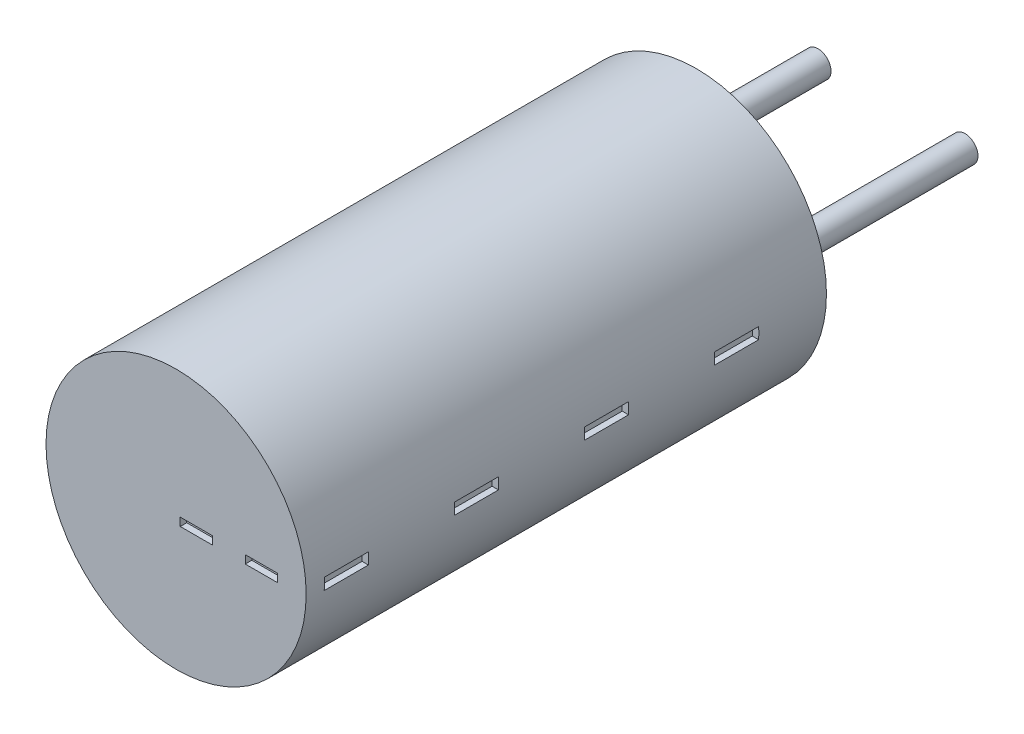
ISO-10303-21;
HEADER;
FILE_DESCRIPTION(('STEP AP214'),'2;1');
FILE_NAME('part.step','',(''),(''),'','','');
FILE_SCHEMA(('AUTOMOTIVE_DESIGN { 1 0 10303 214 1 1 1 1 }'));
ENDSEC;
DATA;
#1=APPLICATION_CONTEXT('core data for automotive mechanical design processes');
#2=APPLICATION_PROTOCOL_DEFINITION('international standard','automotive_design',2000,#1);
#3=PRODUCT_CONTEXT('',#1,'mechanical');
#4=PRODUCT('Part','Part','',(#3));
#5=PRODUCT_RELATED_PRODUCT_CATEGORY('part','',(#4));
#6=PRODUCT_DEFINITION_FORMATION('','',#4);
#7=PRODUCT_DEFINITION_CONTEXT('part definition',#1,'design');
#8=PRODUCT_DEFINITION('design','',#6,#7);
#9=PRODUCT_DEFINITION_SHAPE('','',#8);
#10=(LENGTH_UNIT() NAMED_UNIT(*) SI_UNIT(.MILLI.,.METRE.));
#11=(NAMED_UNIT(*) PLANE_ANGLE_UNIT() SI_UNIT($,.RADIAN.));
#12=(NAMED_UNIT(*) SI_UNIT($,.STERADIAN.) SOLID_ANGLE_UNIT());
#13=UNCERTAINTY_MEASURE_WITH_UNIT(LENGTH_MEASURE(1.E-05),#10,'distance_accuracy_value','');
#14=(GEOMETRIC_REPRESENTATION_CONTEXT(3) GLOBAL_UNCERTAINTY_ASSIGNED_CONTEXT((#13)) GLOBAL_UNIT_ASSIGNED_CONTEXT((#10,
#11,#12)) REPRESENTATION_CONTEXT('',''));
#15=CARTESIAN_POINT('',(0.,0.,0.));
#16=DIRECTION('',(0.,0.,1.));
#17=DIRECTION('',(1.,0.,0.));
#18=AXIS2_PLACEMENT_3D('',#15,#16,#17);
#19=CARTESIAN_POINT('',(0.,0.,0.));
#20=DIRECTION('',(0.,0.,1.));
#21=DIRECTION('',(1.,0.,0.));
#22=AXIS2_PLACEMENT_3D('',#19,#20,#21);
#23=PLANE('',#22);
#24=CARTESIAN_POINT('',(1.13,0.,0.));
#25=DIRECTION('',(0.,0.,1.));
#26=DIRECTION('',(1.,0.,0.));
#27=AXIS2_PLACEMENT_3D('',#24,#25,#26);
#28=CIRCLE('',#27,0.2);
#29=CARTESIAN_POINT('',(1.33,0.,0.));
#30=VERTEX_POINT('',#29);
#31=EDGE_CURVE('E434',#30,#30,#28,.F.);
#32=ORIENTED_EDGE('',*,*,#31,.F.);
#33=EDGE_LOOP('',(#32));
#34=FACE_BOUND('',#33,.T.);
#35=CARTESIAN_POINT('',(0.,0.,0.));
#36=DIRECTION('',(0.,0.,1.));
#37=DIRECTION('',(1.,0.,0.));
#38=AXIS2_PLACEMENT_3D('',#35,#36,#37);
#39=CIRCLE('',#38,2.);
#40=CARTESIAN_POINT('',(2.,0.,0.));
#41=VERTEX_POINT('',#40);
#42=EDGE_CURVE('E429',#41,#41,#39,.T.);
#43=ORIENTED_EDGE('',*,*,#42,.F.);
#44=EDGE_LOOP('',(#43));
#45=FACE_BOUND('',#44,.T.);
#46=CARTESIAN_POINT('',(-1.13,0.,0.));
#47=DIRECTION('',(0.,0.,1.));
#48=DIRECTION('',(1.,0.,0.));
#49=AXIS2_PLACEMENT_3D('',#46,#47,#48);
#50=CIRCLE('',#49,0.2);
#51=CARTESIAN_POINT('',(-0.929999999999999,0.,0.));
#52=VERTEX_POINT('',#51);
#53=EDGE_CURVE('E440',#52,#52,#50,.F.);
#54=ORIENTED_EDGE('',*,*,#53,.F.);
#55=EDGE_LOOP('',(#54));
#56=FACE_BOUND('',#55,.T.);
#57=ADVANCED_FACE('F39',(#34,#45,#56),#23,.F.);
#58=CARTESIAN_POINT('',(0.,0.,8.));
#59=DIRECTION('',(0.,0.,-1.));
#60=DIRECTION('',(-1.,0.,0.));
#61=AXIS2_PLACEMENT_3D('',#58,#59,#60);
#62=CYLINDRICAL_SURFACE('',#61,2.);
#63=CARTESIAN_POINT('',(0.,0.,1.72011761368307));
#64=DIRECTION('',(0.,0.,1.));
#65=DIRECTION('',(1.,0.,0.));
#66=AXIS2_PLACEMENT_3D('',#63,#64,#65);
#67=CIRCLE('',#66,2.);
#68=CARTESIAN_POINT('',(1.99793198999695,-0.0909272420500958,1.72011761368307));
#69=VERTEX_POINT('',#68);
#70=CARTESIAN_POINT('',(1.9981691255838,0.085557849223008,1.72011761368307));
#71=VERTEX_POINT('',#70);
#72=EDGE_CURVE('E489',#69,#71,#67,.T.);
#73=ORIENTED_EDGE('',*,*,#72,.T.);
#74=DIRECTION('',(0.,0.,-1.));
#75=VECTOR('',#74,1.);
#76=CARTESIAN_POINT('',(1.9981691255838,0.085557849223008,8.));
#77=LINE('',#76,#75);
#78=CARTESIAN_POINT('',(1.9981691255838,0.085557849223008,1.04065001228162));
#79=VERTEX_POINT('',#78);
#80=EDGE_CURVE('E11',#71,#79,#77,.T.);
#81=ORIENTED_EDGE('',*,*,#80,.T.);
#82=CARTESIAN_POINT('',(0.,0.,1.04065001228162));
#83=DIRECTION('',(0.,0.,-1.));
#84=DIRECTION('',(-1.,0.,0.));
#85=AXIS2_PLACEMENT_3D('',#82,#83,#84);
#86=CIRCLE('',#85,2.);
#87=CARTESIAN_POINT('',(1.99793198999695,-0.0909272420500958,1.04065001228162));
#88=VERTEX_POINT('',#87);
#89=EDGE_CURVE('E48',#79,#88,#86,.T.);
#90=ORIENTED_EDGE('',*,*,#89,.T.);
#91=DIRECTION('',(0.,0.,-1.));
#92=VECTOR('',#91,1.);
#93=CARTESIAN_POINT('',(1.99793198999695,-0.0909272420500958,8.));
#94=LINE('',#93,#92);
#95=EDGE_CURVE('E492',#88,#69,#94,.F.);
#96=ORIENTED_EDGE('',*,*,#95,.T.);
#97=EDGE_LOOP('',(#73,#81,#90,#96));
#98=FACE_BOUND('',#97,.T.);
#99=CARTESIAN_POINT('',(0.,0.,3.72011761368307));
#100=DIRECTION('',(0.,0.,1.));
#101=DIRECTION('',(1.,0.,0.));
#102=AXIS2_PLACEMENT_3D('',#99,#100,#101);
#103=CIRCLE('',#102,2.);
#104=CARTESIAN_POINT('',(1.99793198999695,-0.0909272420500958,3.72011761368307));
#105=VERTEX_POINT('',#104);
#106=CARTESIAN_POINT('',(1.9981691255838,0.085557849223008,3.72011761368307));
#107=VERTEX_POINT('',#106);
#108=EDGE_CURVE('E474',#105,#107,#103,.T.);
#109=ORIENTED_EDGE('',*,*,#108,.T.);
#110=DIRECTION('',(0.,0.,-1.));
#111=VECTOR('',#110,1.);
#112=CARTESIAN_POINT('',(1.9981691255838,0.085557849223008,8.));
#113=LINE('',#112,#111);
#114=CARTESIAN_POINT('',(1.9981691255838,0.085557849223008,3.04065001228162));
#115=VERTEX_POINT('',#114);
#116=EDGE_CURVE('E485',#107,#115,#113,.T.);
#117=ORIENTED_EDGE('',*,*,#116,.T.);
#118=CARTESIAN_POINT('',(0.,0.,3.04065001228162));
#119=DIRECTION('',(0.,0.,-1.));
#120=DIRECTION('',(-1.,0.,0.));
#121=AXIS2_PLACEMENT_3D('',#118,#119,#120);
#122=CIRCLE('',#121,2.);
#123=CARTESIAN_POINT('',(1.99793198999695,-0.0909272420500958,3.04065001228162));
#124=VERTEX_POINT('',#123);
#125=EDGE_CURVE('E481',#115,#124,#122,.T.);
#126=ORIENTED_EDGE('',*,*,#125,.T.);
#127=DIRECTION('',(0.,0.,-1.));
#128=VECTOR('',#127,1.);
#129=CARTESIAN_POINT('',(1.99793198999695,-0.0909272420500958,8.));
#130=LINE('',#129,#128);
#131=EDGE_CURVE('E477',#124,#105,#130,.F.);
#132=ORIENTED_EDGE('',*,*,#131,.T.);
#133=EDGE_LOOP('',(#109,#117,#126,#132));
#134=FACE_BOUND('',#133,.T.);
#135=CARTESIAN_POINT('',(0.,0.,5.72011761368307));
#136=DIRECTION('',(0.,0.,1.));
#137=DIRECTION('',(1.,0.,0.));
#138=AXIS2_PLACEMENT_3D('',#135,#136,#137);
#139=CIRCLE('',#138,2.);
#140=CARTESIAN_POINT('',(1.99793198999695,-0.0909272420500958,5.72011761368307));
#141=VERTEX_POINT('',#140);
#142=CARTESIAN_POINT('',(1.9981691255838,0.085557849223008,5.72011761368307));
#143=VERTEX_POINT('',#142);
#144=EDGE_CURVE('E459',#141,#143,#139,.T.);
#145=ORIENTED_EDGE('',*,*,#144,.T.);
#146=DIRECTION('',(0.,0.,-1.));
#147=VECTOR('',#146,1.);
#148=CARTESIAN_POINT('',(1.9981691255838,0.085557849223008,8.));
#149=LINE('',#148,#147);
#150=CARTESIAN_POINT('',(1.9981691255838,0.085557849223008,5.04065001228162));
#151=VERTEX_POINT('',#150);
#152=EDGE_CURVE('E470',#143,#151,#149,.T.);
#153=ORIENTED_EDGE('',*,*,#152,.T.);
#154=CARTESIAN_POINT('',(0.,0.,5.04065001228162));
#155=DIRECTION('',(0.,0.,-1.));
#156=DIRECTION('',(-1.,0.,0.));
#157=AXIS2_PLACEMENT_3D('',#154,#155,#156);
#158=CIRCLE('',#157,2.);
#159=CARTESIAN_POINT('',(1.99793198999695,-0.0909272420500958,5.04065001228162));
#160=VERTEX_POINT('',#159);
#161=EDGE_CURVE('E466',#151,#160,#158,.T.);
#162=ORIENTED_EDGE('',*,*,#161,.T.);
#163=DIRECTION('',(0.,0.,-1.));
#164=VECTOR('',#163,1.);
#165=CARTESIAN_POINT('',(1.99793198999695,-0.0909272420500958,8.));
#166=LINE('',#165,#164);
#167=EDGE_CURVE('E462',#160,#141,#166,.F.);
#168=ORIENTED_EDGE('',*,*,#167,.T.);
#169=EDGE_LOOP('',(#145,#153,#162,#168));
#170=FACE_BOUND('',#169,.T.);
#171=CARTESIAN_POINT('',(0.,0.,7.72011761368307));
#172=DIRECTION('',(0.,0.,1.));
#173=DIRECTION('',(1.,0.,0.));
#174=AXIS2_PLACEMENT_3D('',#171,#172,#173);
#175=CIRCLE('',#174,2.);
#176=CARTESIAN_POINT('',(1.99793198999695,-0.0909272420500958,7.72011761368307));
#177=VERTEX_POINT('',#176);
#178=CARTESIAN_POINT('',(1.9981691255838,0.085557849223008,7.72011761368307));
#179=VERTEX_POINT('',#178);
#180=EDGE_CURVE('E448',#177,#179,#175,.T.);
#181=ORIENTED_EDGE('',*,*,#180,.T.);
#182=DIRECTION('',(0.,0.,-1.));
#183=VECTOR('',#182,1.);
#184=CARTESIAN_POINT('',(1.9981691255838,0.085557849223008,8.));
#185=LINE('',#184,#183);
#186=CARTESIAN_POINT('',(1.9981691255838,0.085557849223008,7.04065001228162));
#187=VERTEX_POINT('',#186);
#188=EDGE_CURVE('E455',#179,#187,#185,.T.);
#189=ORIENTED_EDGE('',*,*,#188,.T.);
#190=CARTESIAN_POINT('',(0.,0.,7.04065001228162));
#191=DIRECTION('',(0.,0.,-1.));
#192=DIRECTION('',(-1.,0.,0.));
#193=AXIS2_PLACEMENT_3D('',#190,#191,#192);
#194=CIRCLE('',#193,2.);
#195=CARTESIAN_POINT('',(1.99793198999695,-0.0909272420500958,7.04065001228162));
#196=VERTEX_POINT('',#195);
#197=EDGE_CURVE('E444',#187,#196,#194,.T.);
#198=ORIENTED_EDGE('',*,*,#197,.T.);
#199=DIRECTION('',(0.,0.,-1.));
#200=VECTOR('',#199,1.);
#201=CARTESIAN_POINT('',(1.99793198999695,-0.0909272420500958,8.));
#202=LINE('',#201,#200);
#203=EDGE_CURVE('E451',#196,#177,#202,.F.);
#204=ORIENTED_EDGE('',*,*,#203,.T.);
#205=EDGE_LOOP('',(#181,#189,#198,#204));
#206=FACE_BOUND('',#205,.T.);
#207=CARTESIAN_POINT('',(0.,0.,8.));
#208=DIRECTION('',(0.,0.,1.));
#209=DIRECTION('',(1.,0.,0.));
#210=AXIS2_PLACEMENT_3D('',#207,#208,#209);
#211=CIRCLE('',#210,2.);
#212=CARTESIAN_POINT('',(2.,0.,8.));
#213=VERTEX_POINT('',#212);
#214=EDGE_CURVE('E430',#213,#213,#211,.T.);
#215=ORIENTED_EDGE('',*,*,#214,.F.);
#216=EDGE_LOOP('',(#215));
#217=FACE_BOUND('',#216,.T.);
#218=ORIENTED_EDGE('',*,*,#42,.T.);
#219=EDGE_LOOP('',(#218));
#220=FACE_BOUND('',#219,.T.);
#221=ADVANCED_FACE('F41',(#98,#134,#170,#206,#217,#220),#62,.T.);
#222=CARTESIAN_POINT('',(0.,0.,8.));
#223=DIRECTION('',(0.,0.,1.));
#224=DIRECTION('',(1.,0.,0.));
#225=AXIS2_PLACEMENT_3D('',#222,#223,#224);
#226=PLANE('',#225);
#227=DIRECTION('',(-1.,0.,0.));
#228=VECTOR('',#227,1.);
#229=CARTESIAN_POINT('',(1.06402405221597,0.0598666533728206,8.));
#230=LINE('',#229,#228);
#231=CARTESIAN_POINT('',(1.55933302559761,0.0598666533728206,8.));
#232=VERTEX_POINT('',#231);
#233=CARTESIAN_POINT('',(1.06402405221597,0.0598666533728206,8.));
#234=VERTEX_POINT('',#233);
#235=EDGE_CURVE('E55',#232,#234,#230,.T.);
#236=ORIENTED_EDGE('',*,*,#235,.F.);
#237=DIRECTION('',(0.,1.,0.));
#238=VECTOR('',#237,1.);
#239=CARTESIAN_POINT('',(1.55933302559761,0.0598666533728206,8.));
#240=LINE('',#239,#238);
#241=CARTESIAN_POINT('',(1.55933302559761,-0.0652113702084008,8.));
#242=VERTEX_POINT('',#241);
#243=EDGE_CURVE('E224',#242,#232,#240,.T.);
#244=ORIENTED_EDGE('',*,*,#243,.F.);
#245=DIRECTION('',(1.,0.,0.));
#246=VECTOR('',#245,1.);
#247=CARTESIAN_POINT('',(1.06402405221597,-0.0652113702084008,8.));
#248=LINE('',#247,#246);
#249=CARTESIAN_POINT('',(1.06402405221597,-0.0652113702084008,8.));
#250=VERTEX_POINT('',#249);
#251=EDGE_CURVE('E230',#250,#242,#248,.T.);
#252=ORIENTED_EDGE('',*,*,#251,.F.);
#253=DIRECTION('',(0.,-1.,0.));
#254=VECTOR('',#253,1.);
#255=CARTESIAN_POINT('',(1.06402405221597,0.0598666533728206,8.));
#256=LINE('',#255,#254);
#257=EDGE_CURVE('E239',#234,#250,#256,.T.);
#258=ORIENTED_EDGE('',*,*,#257,.F.);
#259=EDGE_LOOP('',(#236,#244,#252,#258));
#260=FACE_BOUND('',#259,.T.);
#261=DIRECTION('',(0.,-1.,0.));
#262=VECTOR('',#261,1.);
#263=CARTESIAN_POINT('',(0.0640240522159683,0.0598666533728206,8.));
#264=LINE('',#263,#262);
#265=CARTESIAN_POINT('',(0.0640240522159683,0.0598666533728206,8.));
#266=VERTEX_POINT('',#265);
#267=CARTESIAN_POINT('',(0.0640240522159683,-0.0652113702084008,8.));
#268=VERTEX_POINT('',#267);
#269=EDGE_CURVE('E63',#266,#268,#264,.T.);
#270=ORIENTED_EDGE('',*,*,#269,.F.);
#271=DIRECTION('',(-1.,0.,0.));
#272=VECTOR('',#271,1.);
#273=CARTESIAN_POINT('',(0.0640240522159683,0.0598666533728206,8.));
#274=LINE('',#273,#272);
#275=CARTESIAN_POINT('',(0.559333025597606,0.0598666533728206,8.));
#276=VERTEX_POINT('',#275);
#277=EDGE_CURVE('E258',#276,#266,#274,.T.);
#278=ORIENTED_EDGE('',*,*,#277,.F.);
#279=DIRECTION('',(0.,1.,0.));
#280=VECTOR('',#279,1.);
#281=CARTESIAN_POINT('',(0.559333025597606,0.0598666533728206,8.));
#282=LINE('',#281,#280);
#283=CARTESIAN_POINT('',(0.559333025597606,-0.0652113702084008,8.));
#284=VERTEX_POINT('',#283);
#285=EDGE_CURVE('E277',#284,#276,#282,.T.);
#286=ORIENTED_EDGE('',*,*,#285,.F.);
#287=DIRECTION('',(1.,0.,0.));
#288=VECTOR('',#287,1.);
#289=CARTESIAN_POINT('',(0.0640240522159683,-0.0652113702084008,8.));
#290=LINE('',#289,#288);
#291=EDGE_CURVE('E273',#268,#284,#290,.T.);
#292=ORIENTED_EDGE('',*,*,#291,.F.);
#293=EDGE_LOOP('',(#270,#278,#286,#292));
#294=FACE_BOUND('',#293,.T.);
#295=ORIENTED_EDGE('',*,*,#214,.T.);
#296=EDGE_LOOP('',(#295));
#297=FACE_BOUND('',#296,.T.);
#298=ADVANCED_FACE('F529',(#260,#294,#297),#226,.T.);
#299=CARTESIAN_POINT('',(1.13,0.,-3.));
#300=DIRECTION('',(0.,0.,1.));
#301=DIRECTION('',(1.,0.,0.));
#302=AXIS2_PLACEMENT_3D('',#299,#300,#301);
#303=CYLINDRICAL_SURFACE('',#302,0.2);
#304=CARTESIAN_POINT('',(1.13,0.,-3.));
#305=DIRECTION('',(0.,0.,-1.));
#306=DIRECTION('',(-1.,0.,0.));
#307=AXIS2_PLACEMENT_3D('',#304,#305,#306);
#308=CIRCLE('',#307,0.2);
#309=CARTESIAN_POINT('',(0.93,0.,-3.));
#310=VERTEX_POINT('',#309);
#311=EDGE_CURVE('E425',#310,#310,#308,.T.);
#312=ORIENTED_EDGE('',*,*,#311,.F.);
#313=EDGE_LOOP('',(#312));
#314=FACE_BOUND('',#313,.T.);
#315=ORIENTED_EDGE('',*,*,#31,.T.);
#316=EDGE_LOOP('',(#315));
#317=FACE_BOUND('',#316,.T.);
#318=ADVANCED_FACE('F535',(#314,#317),#303,.T.);
#319=CARTESIAN_POINT('',(1.13,0.,-3.));
#320=DIRECTION('',(0.,0.,-1.));
#321=DIRECTION('',(-1.,0.,0.));
#322=AXIS2_PLACEMENT_3D('',#319,#320,#321);
#323=PLANE('',#322);
#324=ORIENTED_EDGE('',*,*,#311,.T.);
#325=EDGE_LOOP('',(#324));
#326=FACE_BOUND('',#325,.T.);
#327=ADVANCED_FACE('F539',(#326),#323,.T.);
#328=CARTESIAN_POINT('',(-1.13,0.,-3.));
#329=DIRECTION('',(0.,0.,1.));
#330=DIRECTION('',(1.,0.,0.));
#331=AXIS2_PLACEMENT_3D('',#328,#329,#330);
#332=CYLINDRICAL_SURFACE('',#331,0.2);
#333=CARTESIAN_POINT('',(-1.13,0.,-3.));
#334=DIRECTION('',(0.,0.,-1.));
#335=DIRECTION('',(1.,0.,0.));
#336=AXIS2_PLACEMENT_3D('',#333,#334,#335);
#337=CIRCLE('',#336,0.2);
#338=CARTESIAN_POINT('',(-0.929999999999999,0.,-3.));
#339=VERTEX_POINT('',#338);
#340=EDGE_CURVE('E411',#339,#339,#337,.T.);
#341=ORIENTED_EDGE('',*,*,#340,.F.);
#342=EDGE_LOOP('',(#341));
#343=FACE_BOUND('',#342,.T.);
#344=ORIENTED_EDGE('',*,*,#53,.T.);
#345=EDGE_LOOP('',(#344));
#346=FACE_BOUND('',#345,.T.);
#347=ADVANCED_FACE('F543',(#343,#346),#332,.T.);
#348=CARTESIAN_POINT('',(-1.13,0.,-3.));
#349=DIRECTION('',(0.,0.,1.));
#350=DIRECTION('',(1.,0.,0.));
#351=AXIS2_PLACEMENT_3D('',#348,#349,#350);
#352=PLANE('',#351);
#353=ORIENTED_EDGE('',*,*,#340,.T.);
#354=EDGE_LOOP('',(#353));
#355=FACE_BOUND('',#354,.T.);
#356=ADVANCED_FACE('F547',(#355),#352,.F.);
#357=CARTESIAN_POINT('',(1.9,0.085557849223008,7.72011761368307));
#358=DIRECTION('',(0.,0.,1.));
#359=DIRECTION('',(1.,0.,0.));
#360=AXIS2_PLACEMENT_3D('',#357,#358,#359);
#361=PLANE('',#360);
#362=ORIENTED_EDGE('',*,*,#180,.F.);
#363=DIRECTION('',(1.,0.,0.));
#364=VECTOR('',#363,1.);
#365=CARTESIAN_POINT('',(1.9,-0.0909272420500958,7.72011761368307));
#366=LINE('',#365,#364);
#367=CARTESIAN_POINT('',(1.9,-0.0909272420500958,7.72011761368307));
#368=VERTEX_POINT('',#367);
#369=EDGE_CURVE('E406',#368,#177,#366,.T.);
#370=ORIENTED_EDGE('',*,*,#369,.F.);
#371=DIRECTION('',(0.,-1.,0.));
#372=VECTOR('',#371,1.);
#373=CARTESIAN_POINT('',(1.9,0.085557849223008,7.72011761368307));
#374=LINE('',#373,#372);
#375=CARTESIAN_POINT('',(1.9,0.085557849223008,7.72011761368307));
#376=VERTEX_POINT('',#375);
#377=EDGE_CURVE('E379',#376,#368,#374,.T.);
#378=ORIENTED_EDGE('',*,*,#377,.F.);
#379=DIRECTION('',(1.,0.,0.));
#380=VECTOR('',#379,1.);
#381=CARTESIAN_POINT('',(1.9,0.085557849223008,7.72011761368307));
#382=LINE('',#381,#380);
#383=EDGE_CURVE('E407',#376,#179,#382,.T.);
#384=ORIENTED_EDGE('',*,*,#383,.T.);
#385=EDGE_LOOP('',(#362,#370,#378,#384));
#386=FACE_BOUND('',#385,.T.);
#387=ADVANCED_FACE('F551',(#386),#361,.F.);
#388=CARTESIAN_POINT('',(1.9,0.085557849223008,7.72011761368307));
#389=DIRECTION('',(0.,1.,0.));
#390=DIRECTION('',(0.,0.,1.));
#391=AXIS2_PLACEMENT_3D('',#388,#389,#390);
#392=PLANE('',#391);
#393=ORIENTED_EDGE('',*,*,#383,.F.);
#394=DIRECTION('',(0.,0.,1.));
#395=VECTOR('',#394,1.);
#396=CARTESIAN_POINT('',(1.9,0.085557849223008,7.72011761368307));
#397=LINE('',#396,#395);
#398=CARTESIAN_POINT('',(1.9,0.085557849223008,7.04065001228162));
#399=VERTEX_POINT('',#398);
#400=EDGE_CURVE('E402',#399,#376,#397,.T.);
#401=ORIENTED_EDGE('',*,*,#400,.F.);
#402=DIRECTION('',(1.,0.,0.));
#403=VECTOR('',#402,1.);
#404=CARTESIAN_POINT('',(1.9,0.085557849223008,7.04065001228162));
#405=LINE('',#404,#403);
#406=EDGE_CURVE('E412',#399,#187,#405,.T.);
#407=ORIENTED_EDGE('',*,*,#406,.T.);
#408=ORIENTED_EDGE('',*,*,#188,.F.);
#409=EDGE_LOOP('',(#393,#401,#407,#408));
#410=FACE_BOUND('',#409,.T.);
#411=ADVANCED_FACE('F555',(#410),#392,.F.);
#412=CARTESIAN_POINT('',(1.9,0.085557849223008,7.04065001228162));
#413=DIRECTION('',(0.,0.,-1.));
#414=DIRECTION('',(-1.,0.,0.));
#415=AXIS2_PLACEMENT_3D('',#412,#413,#414);
#416=PLANE('',#415);
#417=ORIENTED_EDGE('',*,*,#406,.F.);
#418=DIRECTION('',(0.,1.,0.));
#419=VECTOR('',#418,1.);
#420=CARTESIAN_POINT('',(1.9,0.085557849223008,7.04065001228162));
#421=LINE('',#420,#419);
#422=CARTESIAN_POINT('',(1.9,-0.0909272420500958,7.04065001228162));
#423=VERTEX_POINT('',#422);
#424=EDGE_CURVE('E398',#423,#399,#421,.T.);
#425=ORIENTED_EDGE('',*,*,#424,.F.);
#426=DIRECTION('',(1.,0.,0.));
#427=VECTOR('',#426,1.);
#428=CARTESIAN_POINT('',(1.9,-0.0909272420500958,7.04065001228162));
#429=LINE('',#428,#427);
#430=EDGE_CURVE('E416',#423,#196,#429,.T.);
#431=ORIENTED_EDGE('',*,*,#430,.T.);
#432=ORIENTED_EDGE('',*,*,#197,.F.);
#433=EDGE_LOOP('',(#417,#425,#431,#432));
#434=FACE_BOUND('',#433,.T.);
#435=ADVANCED_FACE('F561',(#434),#416,.F.);
#436=CARTESIAN_POINT('',(1.9,-0.0909272420500958,7.72011761368307));
#437=DIRECTION('',(0.,-1.,0.));
#438=DIRECTION('',(0.,0.,-1.));
#439=AXIS2_PLACEMENT_3D('',#436,#437,#438);
#440=PLANE('',#439);
#441=ORIENTED_EDGE('',*,*,#430,.F.);
#442=DIRECTION('',(0.,0.,-1.));
#443=VECTOR('',#442,1.);
#444=CARTESIAN_POINT('',(1.9,-0.0909272420500958,7.72011761368307));
#445=LINE('',#444,#443);
#446=EDGE_CURVE('E394',#368,#423,#445,.T.);
#447=ORIENTED_EDGE('',*,*,#446,.F.);
#448=ORIENTED_EDGE('',*,*,#369,.T.);
#449=ORIENTED_EDGE('',*,*,#203,.F.);
#450=EDGE_LOOP('',(#441,#447,#448,#449));
#451=FACE_BOUND('',#450,.T.);
#452=ADVANCED_FACE('F557',(#451),#440,.F.);
#453=CARTESIAN_POINT('',(1.9,-0.0909272420500958,7.72011761368307));
#454=DIRECTION('',(1.,0.,0.));
#455=DIRECTION('',(0.,0.,-1.));
#456=AXIS2_PLACEMENT_3D('',#453,#454,#455);
#457=PLANE('',#456);
#458=ORIENTED_EDGE('',*,*,#377,.T.);
#459=ORIENTED_EDGE('',*,*,#446,.T.);
#460=ORIENTED_EDGE('',*,*,#424,.T.);
#461=ORIENTED_EDGE('',*,*,#400,.T.);
#462=EDGE_LOOP('',(#458,#459,#460,#461));
#463=FACE_BOUND('',#462,.T.);
#464=ADVANCED_FACE('F560',(#463),#457,.T.);
#465=CARTESIAN_POINT('',(1.9,0.085557849223008,5.72011761368307));
#466=DIRECTION('',(0.,1.,0.));
#467=DIRECTION('',(0.,0.,1.));
#468=AXIS2_PLACEMENT_3D('',#465,#466,#467);
#469=PLANE('',#468);
#470=DIRECTION('',(1.,0.,0.));
#471=VECTOR('',#470,1.);
#472=CARTESIAN_POINT('',(1.9,0.085557849223008,5.72011761368307));
#473=LINE('',#472,#471);
#474=CARTESIAN_POINT('',(1.9,0.085557849223008,5.72011761368307));
#475=VERTEX_POINT('',#474);
#476=EDGE_CURVE('E374',#475,#143,#473,.T.);
#477=ORIENTED_EDGE('',*,*,#476,.F.);
#478=DIRECTION('',(0.,0.,1.));
#479=VECTOR('',#478,1.);
#480=CARTESIAN_POINT('',(1.9,0.085557849223008,5.72011761368307));
#481=LINE('',#480,#479);
#482=CARTESIAN_POINT('',(1.9,0.085557849223008,5.04065001228162));
#483=VERTEX_POINT('',#482);
#484=EDGE_CURVE('E347',#483,#475,#481,.T.);
#485=ORIENTED_EDGE('',*,*,#484,.F.);
#486=DIRECTION('',(1.,0.,0.));
#487=VECTOR('',#486,1.);
#488=CARTESIAN_POINT('',(1.9,0.085557849223008,5.04065001228162));
#489=LINE('',#488,#487);
#490=EDGE_CURVE('E375',#483,#151,#489,.T.);
#491=ORIENTED_EDGE('',*,*,#490,.T.);
#492=ORIENTED_EDGE('',*,*,#152,.F.);
#493=EDGE_LOOP('',(#477,#485,#491,#492));
#494=FACE_BOUND('',#493,.T.);
#495=ADVANCED_FACE('F571',(#494),#469,.F.);
#496=CARTESIAN_POINT('',(1.9,0.085557849223008,5.04065001228162));
#497=DIRECTION('',(0.,0.,-1.));
#498=DIRECTION('',(-1.,0.,0.));
#499=AXIS2_PLACEMENT_3D('',#496,#497,#498);
#500=PLANE('',#499);
#501=ORIENTED_EDGE('',*,*,#490,.F.);
#502=DIRECTION('',(0.,1.,0.));
#503=VECTOR('',#502,1.);
#504=CARTESIAN_POINT('',(1.9,0.085557849223008,5.04065001228162));
#505=LINE('',#504,#503);
#506=CARTESIAN_POINT('',(1.9,-0.0909272420500958,5.04065001228162));
#507=VERTEX_POINT('',#506);
#508=EDGE_CURVE('E370',#507,#483,#505,.T.);
#509=ORIENTED_EDGE('',*,*,#508,.F.);
#510=DIRECTION('',(1.,0.,0.));
#511=VECTOR('',#510,1.);
#512=CARTESIAN_POINT('',(1.9,-0.0909272420500958,5.04065001228162));
#513=LINE('',#512,#511);
#514=EDGE_CURVE('E380',#507,#160,#513,.T.);
#515=ORIENTED_EDGE('',*,*,#514,.T.);
#516=ORIENTED_EDGE('',*,*,#161,.F.);
#517=EDGE_LOOP('',(#501,#509,#515,#516));
#518=FACE_BOUND('',#517,.T.);
#519=ADVANCED_FACE('F575',(#518),#500,.F.);
#520=CARTESIAN_POINT('',(1.9,-0.0909272420500958,5.72011761368307));
#521=DIRECTION('',(0.,-1.,0.));
#522=DIRECTION('',(0.,0.,-1.));
#523=AXIS2_PLACEMENT_3D('',#520,#521,#522);
#524=PLANE('',#523);
#525=ORIENTED_EDGE('',*,*,#514,.F.);
#526=DIRECTION('',(0.,0.,-1.));
#527=VECTOR('',#526,1.);
#528=CARTESIAN_POINT('',(1.9,-0.0909272420500958,5.72011761368307));
#529=LINE('',#528,#527);
#530=CARTESIAN_POINT('',(1.9,-0.0909272420500958,5.72011761368307));
#531=VERTEX_POINT('',#530);
#532=EDGE_CURVE('E366',#531,#507,#529,.T.);
#533=ORIENTED_EDGE('',*,*,#532,.F.);
#534=DIRECTION('',(1.,0.,0.));
#535=VECTOR('',#534,1.);
#536=CARTESIAN_POINT('',(1.9,-0.0909272420500958,5.72011761368307));
#537=LINE('',#536,#535);
#538=EDGE_CURVE('E384',#531,#141,#537,.T.);
#539=ORIENTED_EDGE('',*,*,#538,.T.);
#540=ORIENTED_EDGE('',*,*,#167,.F.);
#541=EDGE_LOOP('',(#525,#533,#539,#540));
#542=FACE_BOUND('',#541,.T.);
#543=ADVANCED_FACE('F581',(#542),#524,.F.);
#544=CARTESIAN_POINT('',(1.9,0.085557849223008,5.72011761368307));
#545=DIRECTION('',(0.,0.,1.));
#546=DIRECTION('',(1.,0.,0.));
#547=AXIS2_PLACEMENT_3D('',#544,#545,#546);
#548=PLANE('',#547);
#549=ORIENTED_EDGE('',*,*,#144,.F.);
#550=ORIENTED_EDGE('',*,*,#538,.F.);
#551=DIRECTION('',(0.,-1.,0.));
#552=VECTOR('',#551,1.);
#553=CARTESIAN_POINT('',(1.9,0.085557849223008,5.72011761368307));
#554=LINE('',#553,#552);
#555=EDGE_CURVE('E362',#475,#531,#554,.T.);
#556=ORIENTED_EDGE('',*,*,#555,.F.);
#557=ORIENTED_EDGE('',*,*,#476,.T.);
#558=EDGE_LOOP('',(#549,#550,#556,#557));
#559=FACE_BOUND('',#558,.T.);
#560=ADVANCED_FACE('F577',(#559),#548,.F.);
#561=CARTESIAN_POINT('',(1.9,0.085557849223008,5.04065001228162));
#562=DIRECTION('',(-1.,0.,0.));
#563=DIRECTION('',(0.,0.,1.));
#564=AXIS2_PLACEMENT_3D('',#561,#562,#563);
#565=PLANE('',#564);
#566=ORIENTED_EDGE('',*,*,#484,.T.);
#567=ORIENTED_EDGE('',*,*,#555,.T.);
#568=ORIENTED_EDGE('',*,*,#532,.T.);
#569=ORIENTED_EDGE('',*,*,#508,.T.);
#570=EDGE_LOOP('',(#566,#567,#568,#569));
#571=FACE_BOUND('',#570,.T.);
#572=ADVANCED_FACE('F580',(#571),#565,.F.);
#573=CARTESIAN_POINT('',(1.9,0.085557849223008,3.72011761368307));
#574=DIRECTION('',(0.,1.,0.));
#575=DIRECTION('',(0.,0.,1.));
#576=AXIS2_PLACEMENT_3D('',#573,#574,#575);
#577=PLANE('',#576);
#578=DIRECTION('',(1.,0.,0.));
#579=VECTOR('',#578,1.);
#580=CARTESIAN_POINT('',(1.9,0.085557849223008,3.72011761368307));
#581=LINE('',#580,#579);
#582=CARTESIAN_POINT('',(1.9,0.085557849223008,3.72011761368307));
#583=VERTEX_POINT('',#582);
#584=EDGE_CURVE('E342',#583,#107,#581,.T.);
#585=ORIENTED_EDGE('',*,*,#584,.F.);
#586=DIRECTION('',(0.,0.,1.));
#587=VECTOR('',#586,1.);
#588=CARTESIAN_POINT('',(1.9,0.085557849223008,3.72011761368307));
#589=LINE('',#588,#587);
#590=CARTESIAN_POINT('',(1.9,0.085557849223008,3.04065001228162));
#591=VERTEX_POINT('',#590);
#592=EDGE_CURVE('E315',#591,#583,#589,.T.);
#593=ORIENTED_EDGE('',*,*,#592,.F.);
#594=DIRECTION('',(1.,0.,0.));
#595=VECTOR('',#594,1.);
#596=CARTESIAN_POINT('',(1.9,0.085557849223008,3.04065001228162));
#597=LINE('',#596,#595);
#598=EDGE_CURVE('E343',#591,#115,#597,.T.);
#599=ORIENTED_EDGE('',*,*,#598,.T.);
#600=ORIENTED_EDGE('',*,*,#116,.F.);
#601=EDGE_LOOP('',(#585,#593,#599,#600));
#602=FACE_BOUND('',#601,.T.);
#603=ADVANCED_FACE('F591',(#602),#577,.F.);
#604=CARTESIAN_POINT('',(1.9,0.085557849223008,3.04065001228162));
#605=DIRECTION('',(0.,0.,-1.));
#606=DIRECTION('',(-1.,0.,0.));
#607=AXIS2_PLACEMENT_3D('',#604,#605,#606);
#608=PLANE('',#607);
#609=ORIENTED_EDGE('',*,*,#598,.F.);
#610=DIRECTION('',(0.,1.,0.));
#611=VECTOR('',#610,1.);
#612=CARTESIAN_POINT('',(1.9,0.085557849223008,3.04065001228162));
#613=LINE('',#612,#611);
#614=CARTESIAN_POINT('',(1.9,-0.0909272420500958,3.04065001228162));
#615=VERTEX_POINT('',#614);
#616=EDGE_CURVE('E338',#615,#591,#613,.T.);
#617=ORIENTED_EDGE('',*,*,#616,.F.);
#618=DIRECTION('',(1.,0.,0.));
#619=VECTOR('',#618,1.);
#620=CARTESIAN_POINT('',(1.9,-0.0909272420500958,3.04065001228162));
#621=LINE('',#620,#619);
#622=EDGE_CURVE('E348',#615,#124,#621,.T.);
#623=ORIENTED_EDGE('',*,*,#622,.T.);
#624=ORIENTED_EDGE('',*,*,#125,.F.);
#625=EDGE_LOOP('',(#609,#617,#623,#624));
#626=FACE_BOUND('',#625,.T.);
#627=ADVANCED_FACE('F595',(#626),#608,.F.);
#628=CARTESIAN_POINT('',(1.9,-0.0909272420500958,3.72011761368307));
#629=DIRECTION('',(0.,-1.,0.));
#630=DIRECTION('',(0.,0.,-1.));
#631=AXIS2_PLACEMENT_3D('',#628,#629,#630);
#632=PLANE('',#631);
#633=ORIENTED_EDGE('',*,*,#622,.F.);
#634=DIRECTION('',(0.,0.,-1.));
#635=VECTOR('',#634,1.);
#636=CARTESIAN_POINT('',(1.9,-0.0909272420500958,3.72011761368307));
#637=LINE('',#636,#635);
#638=CARTESIAN_POINT('',(1.9,-0.0909272420500958,3.72011761368307));
#639=VERTEX_POINT('',#638);
#640=EDGE_CURVE('E334',#639,#615,#637,.T.);
#641=ORIENTED_EDGE('',*,*,#640,.F.);
#642=DIRECTION('',(1.,0.,0.));
#643=VECTOR('',#642,1.);
#644=CARTESIAN_POINT('',(1.9,-0.0909272420500958,3.72011761368307));
#645=LINE('',#644,#643);
#646=EDGE_CURVE('E352',#639,#105,#645,.T.);
#647=ORIENTED_EDGE('',*,*,#646,.T.);
#648=ORIENTED_EDGE('',*,*,#131,.F.);
#649=EDGE_LOOP('',(#633,#641,#647,#648));
#650=FACE_BOUND('',#649,.T.);
#651=ADVANCED_FACE('F601',(#650),#632,.F.);
#652=CARTESIAN_POINT('',(1.9,0.085557849223008,3.72011761368307));
#653=DIRECTION('',(0.,0.,1.));
#654=DIRECTION('',(1.,0.,0.));
#655=AXIS2_PLACEMENT_3D('',#652,#653,#654);
#656=PLANE('',#655);
#657=ORIENTED_EDGE('',*,*,#108,.F.);
#658=ORIENTED_EDGE('',*,*,#646,.F.);
#659=DIRECTION('',(0.,-1.,0.));
#660=VECTOR('',#659,1.);
#661=CARTESIAN_POINT('',(1.9,0.085557849223008,3.72011761368307));
#662=LINE('',#661,#660);
#663=EDGE_CURVE('E330',#583,#639,#662,.T.);
#664=ORIENTED_EDGE('',*,*,#663,.F.);
#665=ORIENTED_EDGE('',*,*,#584,.T.);
#666=EDGE_LOOP('',(#657,#658,#664,#665));
#667=FACE_BOUND('',#666,.T.);
#668=ADVANCED_FACE('F597',(#667),#656,.F.);
#669=CARTESIAN_POINT('',(1.9,0.085557849223008,3.04065001228162));
#670=DIRECTION('',(-1.,0.,0.));
#671=DIRECTION('',(0.,0.,1.));
#672=AXIS2_PLACEMENT_3D('',#669,#670,#671);
#673=PLANE('',#672);
#674=ORIENTED_EDGE('',*,*,#592,.T.);
#675=ORIENTED_EDGE('',*,*,#663,.T.);
#676=ORIENTED_EDGE('',*,*,#640,.T.);
#677=ORIENTED_EDGE('',*,*,#616,.T.);
#678=EDGE_LOOP('',(#674,#675,#676,#677));
#679=FACE_BOUND('',#678,.T.);
#680=ADVANCED_FACE('F600',(#679),#673,.F.);
#681=CARTESIAN_POINT('',(1.9,0.085557849223008,1.72011761368307));
#682=DIRECTION('',(0.,1.,0.));
#683=DIRECTION('',(0.,0.,1.));
#684=AXIS2_PLACEMENT_3D('',#681,#682,#683);
#685=PLANE('',#684);
#686=DIRECTION('',(1.,0.,0.));
#687=VECTOR('',#686,1.);
#688=CARTESIAN_POINT('',(1.9,0.085557849223008,1.72011761368307));
#689=LINE('',#688,#687);
#690=CARTESIAN_POINT('',(1.9,0.085557849223008,1.72011761368307));
#691=VERTEX_POINT('',#690);
#692=EDGE_CURVE('E311',#691,#71,#689,.T.);
#693=ORIENTED_EDGE('',*,*,#692,.F.);
#694=DIRECTION('',(0.,0.,1.));
#695=VECTOR('',#694,1.);
#696=CARTESIAN_POINT('',(1.9,0.085557849223008,1.72011761368307));
#697=LINE('',#696,#695);
#698=CARTESIAN_POINT('',(1.9,0.085557849223008,1.04065001228162));
#699=VERTEX_POINT('',#698);
#700=EDGE_CURVE('E287',#699,#691,#697,.T.);
#701=ORIENTED_EDGE('',*,*,#700,.F.);
#702=DIRECTION('',(1.,0.,0.));
#703=VECTOR('',#702,1.);
#704=CARTESIAN_POINT('',(1.9,0.085557849223008,1.04065001228162));
#705=LINE('',#704,#703);
#706=EDGE_CURVE('E312',#699,#79,#705,.T.);
#707=ORIENTED_EDGE('',*,*,#706,.T.);
#708=ORIENTED_EDGE('',*,*,#80,.F.);
#709=EDGE_LOOP('',(#693,#701,#707,#708));
#710=FACE_BOUND('',#709,.T.);
#711=ADVANCED_FACE('F505',(#710),#685,.F.);
#712=CARTESIAN_POINT('',(1.9,0.085557849223008,1.04065001228162));
#713=DIRECTION('',(0.,0.,-1.));
#714=DIRECTION('',(-1.,0.,0.));
#715=AXIS2_PLACEMENT_3D('',#712,#713,#714);
#716=PLANE('',#715);
#717=ORIENTED_EDGE('',*,*,#706,.F.);
#718=DIRECTION('',(0.,1.,0.));
#719=VECTOR('',#718,1.);
#720=CARTESIAN_POINT('',(1.9,0.085557849223008,1.04065001228162));
#721=LINE('',#720,#719);
#722=CARTESIAN_POINT('',(1.9,-0.0909272420500958,1.04065001228162));
#723=VERTEX_POINT('',#722);
#724=EDGE_CURVE('E307',#723,#699,#721,.T.);
#725=ORIENTED_EDGE('',*,*,#724,.F.);
#726=DIRECTION('',(1.,0.,0.));
#727=VECTOR('',#726,1.);
#728=CARTESIAN_POINT('',(1.9,-0.0909272420500958,1.04065001228162));
#729=LINE('',#728,#727);
#730=EDGE_CURVE('E316',#723,#88,#729,.T.);
#731=ORIENTED_EDGE('',*,*,#730,.T.);
#732=ORIENTED_EDGE('',*,*,#89,.F.);
#733=EDGE_LOOP('',(#717,#725,#731,#732));
#734=FACE_BOUND('',#733,.T.);
#735=ADVANCED_FACE('F501',(#734),#716,.F.);
#736=CARTESIAN_POINT('',(1.9,-0.0909272420500958,1.72011761368307));
#737=DIRECTION('',(0.,-1.,0.));
#738=DIRECTION('',(0.,0.,-1.));
#739=AXIS2_PLACEMENT_3D('',#736,#737,#738);
#740=PLANE('',#739);
#741=ORIENTED_EDGE('',*,*,#730,.F.);
#742=DIRECTION('',(0.,0.,-1.));
#743=VECTOR('',#742,1.);
#744=CARTESIAN_POINT('',(1.9,-0.0909272420500958,1.72011761368307));
#745=LINE('',#744,#743);
#746=CARTESIAN_POINT('',(1.9,-0.0909272420500958,1.72011761368307));
#747=VERTEX_POINT('',#746);
#748=EDGE_CURVE('E303',#747,#723,#745,.T.);
#749=ORIENTED_EDGE('',*,*,#748,.F.);
#750=DIRECTION('',(1.,0.,0.));
#751=VECTOR('',#750,1.);
#752=CARTESIAN_POINT('',(1.9,-0.0909272420500958,1.72011761368307));
#753=LINE('',#752,#751);
#754=EDGE_CURVE('E320',#747,#69,#753,.T.);
#755=ORIENTED_EDGE('',*,*,#754,.T.);
#756=ORIENTED_EDGE('',*,*,#95,.F.);
#757=EDGE_LOOP('',(#741,#749,#755,#756));
#758=FACE_BOUND('',#757,.T.);
#759=ADVANCED_FACE('F511',(#758),#740,.F.);
#760=CARTESIAN_POINT('',(1.9,0.085557849223008,1.72011761368307));
#761=DIRECTION('',(0.,0.,1.));
#762=DIRECTION('',(1.,0.,0.));
#763=AXIS2_PLACEMENT_3D('',#760,#761,#762);
#764=PLANE('',#763);
#765=ORIENTED_EDGE('',*,*,#72,.F.);
#766=ORIENTED_EDGE('',*,*,#754,.F.);
#767=DIRECTION('',(0.,-1.,0.));
#768=VECTOR('',#767,1.);
#769=CARTESIAN_POINT('',(1.9,0.085557849223008,1.72011761368307));
#770=LINE('',#769,#768);
#771=EDGE_CURVE('E299',#691,#747,#770,.T.);
#772=ORIENTED_EDGE('',*,*,#771,.F.);
#773=ORIENTED_EDGE('',*,*,#692,.T.);
#774=EDGE_LOOP('',(#765,#766,#772,#773));
#775=FACE_BOUND('',#774,.T.);
#776=ADVANCED_FACE('F513',(#775),#764,.F.);
#777=CARTESIAN_POINT('',(1.9,0.085557849223008,1.04065001228162));
#778=DIRECTION('',(-1.,0.,0.));
#779=DIRECTION('',(0.,0.,1.));
#780=AXIS2_PLACEMENT_3D('',#777,#778,#779);
#781=PLANE('',#780);
#782=ORIENTED_EDGE('',*,*,#700,.T.);
#783=ORIENTED_EDGE('',*,*,#771,.T.);
#784=ORIENTED_EDGE('',*,*,#748,.T.);
#785=ORIENTED_EDGE('',*,*,#724,.T.);
#786=EDGE_LOOP('',(#782,#783,#784,#785));
#787=FACE_BOUND('',#786,.T.);
#788=ADVANCED_FACE('F508',(#787),#781,.F.);
#789=CARTESIAN_POINT('',(0.0640240522159683,0.0598666533728206,7.9));
#790=DIRECTION('',(-1.,0.,0.));
#791=DIRECTION('',(0.,0.,1.));
#792=AXIS2_PLACEMENT_3D('',#789,#790,#791);
#793=PLANE('',#792);
#794=ORIENTED_EDGE('',*,*,#269,.T.);
#795=DIRECTION('',(0.,0.,1.));
#796=VECTOR('',#795,1.);
#797=CARTESIAN_POINT('',(0.0640240522159683,-0.0652113702084008,7.9));
#798=LINE('',#797,#796);
#799=CARTESIAN_POINT('',(0.0640240522159683,-0.0652113702084008,7.9));
#800=VERTEX_POINT('',#799);
#801=EDGE_CURVE('E270',#800,#268,#798,.T.);
#802=ORIENTED_EDGE('',*,*,#801,.F.);
#803=DIRECTION('',(0.,-1.,0.));
#804=VECTOR('',#803,1.);
#805=CARTESIAN_POINT('',(0.0640240522159683,0.0598666533728206,7.9));
#806=LINE('',#805,#804);
#807=CARTESIAN_POINT('',(0.0640240522159683,0.0598666533728206,7.9));
#808=VERTEX_POINT('',#807);
#809=EDGE_CURVE('E253',#808,#800,#806,.T.);
#810=ORIENTED_EDGE('',*,*,#809,.F.);
#811=DIRECTION('',(0.,0.,1.));
#812=VECTOR('',#811,1.);
#813=CARTESIAN_POINT('',(0.0640240522159683,0.0598666533728206,7.9));
#814=LINE('',#813,#812);
#815=EDGE_CURVE('E284',#808,#266,#814,.T.);
#816=ORIENTED_EDGE('',*,*,#815,.T.);
#817=EDGE_LOOP('',(#794,#802,#810,#816));
#818=FACE_BOUND('',#817,.T.);
#819=ADVANCED_FACE('F520',(#818),#793,.F.);
#820=CARTESIAN_POINT('',(0.0640240522159683,0.0598666533728206,7.9));
#821=DIRECTION('',(0.,1.,0.));
#822=DIRECTION('',(0.,0.,1.));
#823=AXIS2_PLACEMENT_3D('',#820,#821,#822);
#824=PLANE('',#823);
#825=ORIENTED_EDGE('',*,*,#277,.T.);
#826=ORIENTED_EDGE('',*,*,#815,.F.);
#827=DIRECTION('',(-1.,0.,0.));
#828=VECTOR('',#827,1.);
#829=CARTESIAN_POINT('',(0.0640240522159683,0.0598666533728206,7.9));
#830=LINE('',#829,#828);
#831=CARTESIAN_POINT('',(0.559333025597606,0.0598666533728206,7.9));
#832=VERTEX_POINT('',#831);
#833=EDGE_CURVE('E266',#832,#808,#830,.T.);
#834=ORIENTED_EDGE('',*,*,#833,.F.);
#835=DIRECTION('',(0.,0.,1.));
#836=VECTOR('',#835,1.);
#837=CARTESIAN_POINT('',(0.559333025597606,0.0598666533728206,7.9));
#838=LINE('',#837,#836);
#839=EDGE_CURVE('E288',#832,#276,#838,.T.);
#840=ORIENTED_EDGE('',*,*,#839,.T.);
#841=EDGE_LOOP('',(#825,#826,#834,#840));
#842=FACE_BOUND('',#841,.T.);
#843=ADVANCED_FACE('F621',(#842),#824,.F.);
#844=CARTESIAN_POINT('',(0.559333025597606,0.0598666533728206,7.9));
#845=DIRECTION('',(1.,0.,0.));
#846=DIRECTION('',(0.,0.,-1.));
#847=AXIS2_PLACEMENT_3D('',#844,#845,#846);
#848=PLANE('',#847);
#849=ORIENTED_EDGE('',*,*,#285,.T.);
#850=ORIENTED_EDGE('',*,*,#839,.F.);
#851=DIRECTION('',(0.,1.,0.));
#852=VECTOR('',#851,1.);
#853=CARTESIAN_POINT('',(0.559333025597606,0.0598666533728206,7.9));
#854=LINE('',#853,#852);
#855=CARTESIAN_POINT('',(0.559333025597606,-0.0652113702084008,7.9));
#856=VERTEX_POINT('',#855);
#857=EDGE_CURVE('E262',#856,#832,#854,.T.);
#858=ORIENTED_EDGE('',*,*,#857,.F.);
#859=DIRECTION('',(0.,0.,1.));
#860=VECTOR('',#859,1.);
#861=CARTESIAN_POINT('',(0.559333025597606,-0.0652113702084008,7.9));
#862=LINE('',#861,#860);
#863=EDGE_CURVE('E291',#856,#284,#862,.T.);
#864=ORIENTED_EDGE('',*,*,#863,.T.);
#865=EDGE_LOOP('',(#849,#850,#858,#864));
#866=FACE_BOUND('',#865,.T.);
#867=ADVANCED_FACE('F626',(#866),#848,.F.);
#868=CARTESIAN_POINT('',(0.0640240522159683,-0.0652113702084008,7.9));
#869=DIRECTION('',(0.,-1.,0.));
#870=DIRECTION('',(0.,0.,-1.));
#871=AXIS2_PLACEMENT_3D('',#868,#869,#870);
#872=PLANE('',#871);
#873=ORIENTED_EDGE('',*,*,#291,.T.);
#874=ORIENTED_EDGE('',*,*,#863,.F.);
#875=DIRECTION('',(1.,0.,0.));
#876=VECTOR('',#875,1.);
#877=CARTESIAN_POINT('',(0.0640240522159683,-0.0652113702084008,7.9));
#878=LINE('',#877,#876);
#879=EDGE_CURVE('E257',#800,#856,#878,.T.);
#880=ORIENTED_EDGE('',*,*,#879,.F.);
#881=ORIENTED_EDGE('',*,*,#801,.T.);
#882=EDGE_LOOP('',(#873,#874,#880,#881));
#883=FACE_BOUND('',#882,.T.);
#884=ADVANCED_FACE('F622',(#883),#872,.F.);
#885=CARTESIAN_POINT('',(0.0640240522159683,-0.0652113702084008,7.9));
#886=DIRECTION('',(0.,0.,1.));
#887=DIRECTION('',(1.,0.,0.));
#888=AXIS2_PLACEMENT_3D('',#885,#886,#887);
#889=PLANE('',#888);
#890=ORIENTED_EDGE('',*,*,#809,.T.);
#891=ORIENTED_EDGE('',*,*,#879,.T.);
#892=ORIENTED_EDGE('',*,*,#857,.T.);
#893=ORIENTED_EDGE('',*,*,#833,.T.);
#894=EDGE_LOOP('',(#890,#891,#892,#893));
#895=FACE_BOUND('',#894,.T.);
#896=ADVANCED_FACE('F625',(#895),#889,.T.);
#897=CARTESIAN_POINT('',(1.06402405221597,0.0598666533728206,7.9));
#898=DIRECTION('',(0.,1.,0.));
#899=DIRECTION('',(0.,0.,1.));
#900=AXIS2_PLACEMENT_3D('',#897,#898,#899);
#901=PLANE('',#900);
#902=ORIENTED_EDGE('',*,*,#235,.T.);
#903=DIRECTION('',(0.,0.,1.));
#904=VECTOR('',#903,1.);
#905=CARTESIAN_POINT('',(1.06402405221597,0.0598666533728206,7.9));
#906=LINE('',#905,#904);
#907=CARTESIAN_POINT('',(1.06402405221597,0.0598666533728206,7.9));
#908=VERTEX_POINT('',#907);
#909=EDGE_CURVE('E199',#908,#234,#906,.T.);
#910=ORIENTED_EDGE('',*,*,#909,.F.);
#911=DIRECTION('',(-1.,0.,0.));
#912=VECTOR('',#911,1.);
#913=CARTESIAN_POINT('',(1.06402405221597,0.0598666533728206,7.9));
#914=LINE('',#913,#912);
#915=CARTESIAN_POINT('',(1.55933302559761,0.0598666533728206,7.9));
#916=VERTEX_POINT('',#915);
#917=EDGE_CURVE('E203',#916,#908,#914,.T.);
#918=ORIENTED_EDGE('',*,*,#917,.F.);
#919=DIRECTION('',(0.,0.,1.));
#920=VECTOR('',#919,1.);
#921=CARTESIAN_POINT('',(1.55933302559761,0.0598666533728206,7.9));
#922=LINE('',#921,#920);
#923=EDGE_CURVE('E245',#916,#232,#922,.T.);
#924=ORIENTED_EDGE('',*,*,#923,.T.);
#925=EDGE_LOOP('',(#902,#910,#918,#924));
#926=FACE_BOUND('',#925,.T.);
#927=ADVANCED_FACE('F201',(#926),#901,.F.);
#928=CARTESIAN_POINT('',(1.55933302559761,0.0598666533728206,7.9));
#929=DIRECTION('',(1.,0.,0.));
#930=DIRECTION('',(0.,0.,-1.));
#931=AXIS2_PLACEMENT_3D('',#928,#929,#930);
#932=PLANE('',#931);
#933=ORIENTED_EDGE('',*,*,#243,.T.);
#934=ORIENTED_EDGE('',*,*,#923,.F.);
#935=DIRECTION('',(0.,1.,0.));
#936=VECTOR('',#935,1.);
#937=CARTESIAN_POINT('',(1.55933302559761,0.0598666533728206,7.9));
#938=LINE('',#937,#936);
#939=CARTESIAN_POINT('',(1.55933302559761,-0.0652113702084008,7.9));
#940=VERTEX_POINT('',#939);
#941=EDGE_CURVE('E210',#940,#916,#938,.T.);
#942=ORIENTED_EDGE('',*,*,#941,.F.);
#943=DIRECTION('',(0.,0.,1.));
#944=VECTOR('',#943,1.);
#945=CARTESIAN_POINT('',(1.55933302559761,-0.0652113702084008,7.9));
#946=LINE('',#945,#944);
#947=EDGE_CURVE('E248',#940,#242,#946,.T.);
#948=ORIENTED_EDGE('',*,*,#947,.T.);
#949=EDGE_LOOP('',(#933,#934,#942,#948));
#950=FACE_BOUND('',#949,.T.);
#951=ADVANCED_FACE('F639',(#950),#932,.F.);
#952=CARTESIAN_POINT('',(1.06402405221597,-0.0652113702084008,7.9));
#953=DIRECTION('',(0.,-1.,0.));
#954=DIRECTION('',(0.,0.,-1.));
#955=AXIS2_PLACEMENT_3D('',#952,#953,#954);
#956=PLANE('',#955);
#957=ORIENTED_EDGE('',*,*,#251,.T.);
#958=ORIENTED_EDGE('',*,*,#947,.F.);
#959=DIRECTION('',(1.,0.,0.));
#960=VECTOR('',#959,1.);
#961=CARTESIAN_POINT('',(1.06402405221597,-0.0652113702084008,7.9));
#962=LINE('',#961,#960);
#963=CARTESIAN_POINT('',(1.06402405221597,-0.0652113702084008,7.9));
#964=VERTEX_POINT('',#963);
#965=EDGE_CURVE('E219',#964,#940,#962,.T.);
#966=ORIENTED_EDGE('',*,*,#965,.F.);
#967=DIRECTION('',(0.,0.,1.));
#968=VECTOR('',#967,1.);
#969=CARTESIAN_POINT('',(1.06402405221597,-0.0652113702084008,7.9));
#970=LINE('',#969,#968);
#971=EDGE_CURVE('E209',#964,#250,#970,.T.);
#972=ORIENTED_EDGE('',*,*,#971,.T.);
#973=EDGE_LOOP('',(#957,#958,#966,#972));
#974=FACE_BOUND('',#973,.T.);
#975=ADVANCED_FACE('F642',(#974),#956,.F.);
#976=CARTESIAN_POINT('',(1.06402405221597,0.0598666533728206,7.9));
#977=DIRECTION('',(-1.,0.,0.));
#978=DIRECTION('',(0.,0.,1.));
#979=AXIS2_PLACEMENT_3D('',#976,#977,#978);
#980=PLANE('',#979);
#981=ORIENTED_EDGE('',*,*,#257,.T.);
#982=ORIENTED_EDGE('',*,*,#971,.F.);
#983=DIRECTION('',(0.,-1.,0.));
#984=VECTOR('',#983,1.);
#985=CARTESIAN_POINT('',(1.06402405221597,0.0598666533728206,7.9));
#986=LINE('',#985,#984);
#987=EDGE_CURVE('E213',#908,#964,#986,.T.);
#988=ORIENTED_EDGE('',*,*,#987,.F.);
#989=ORIENTED_EDGE('',*,*,#909,.T.);
#990=EDGE_LOOP('',(#981,#982,#988,#989));
#991=FACE_BOUND('',#990,.T.);
#992=ADVANCED_FACE('F214',(#991),#980,.F.);
#993=CARTESIAN_POINT('',(1.55933302559761,0.0598666533728206,7.9));
#994=DIRECTION('',(0.,0.,-1.));
#995=DIRECTION('',(-1.,0.,0.));
#996=AXIS2_PLACEMENT_3D('',#993,#994,#995);
#997=PLANE('',#996);
#998=ORIENTED_EDGE('',*,*,#917,.T.);
#999=ORIENTED_EDGE('',*,*,#987,.T.);
#1000=ORIENTED_EDGE('',*,*,#965,.T.);
#1001=ORIENTED_EDGE('',*,*,#941,.T.);
#1002=EDGE_LOOP('',(#998,#999,#1000,#1001));
#1003=FACE_BOUND('',#1002,.T.);
#1004=ADVANCED_FACE('F221',(#1003),#997,.F.);
#1005=CLOSED_SHELL('',(#57,#221,#298,#318,#327,#347,#356,#387,#411,#435,#452,#464,#495,#519,
#543,#560,#572,#603,#627,#651,#668,#680,#711,#735,#759,#776,#788,#819,#843,#867,#884,#896,#927,
#951,#975,#992,#1004));
#1006=MANIFOLD_SOLID_BREP('B2',#1005);
#1007=ADVANCED_BREP_SHAPE_REPRESENTATION('',(#18,#1006),#14);
#1008=SHAPE_DEFINITION_REPRESENTATION(#9,#1007);
ENDSEC;
END-ISO-10303-21;
